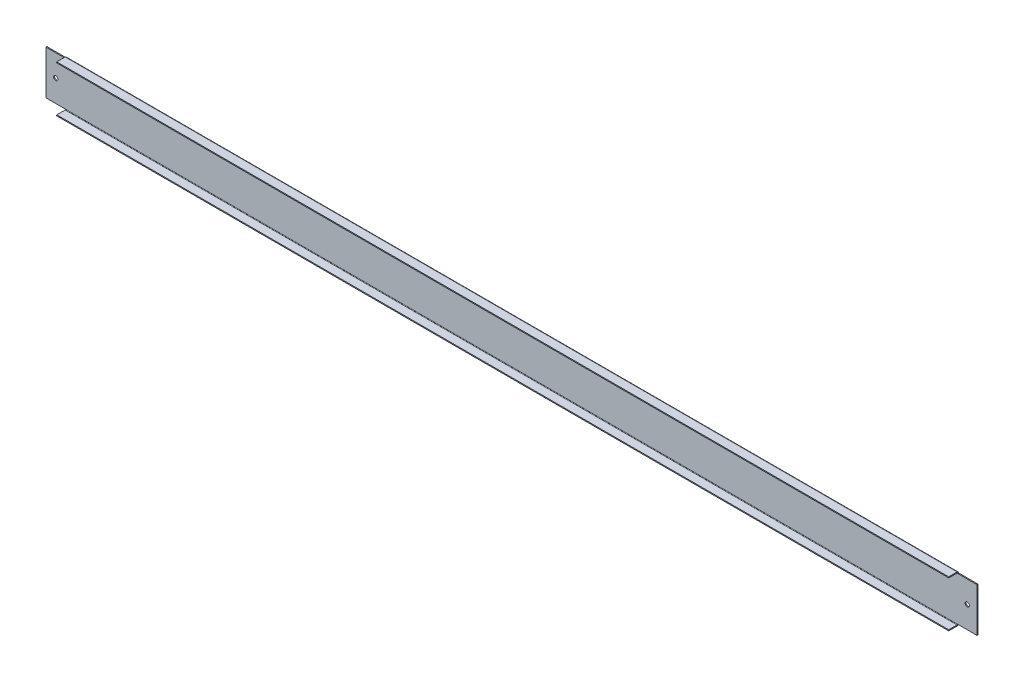
ISO-10303-21;
HEADER;
FILE_DESCRIPTION(('STEP AP214'),'2;1');
FILE_NAME('part.step','',(''),(''),'','','');
FILE_SCHEMA(('AUTOMOTIVE_DESIGN { 1 0 10303 214 1 1 1 1 }'));
ENDSEC;
DATA;
#1=APPLICATION_CONTEXT('core data for automotive mechanical design processes');
#2=APPLICATION_PROTOCOL_DEFINITION('international standard','automotive_design',2000,#1);
#3=PRODUCT_CONTEXT('',#1,'mechanical');
#4=PRODUCT('Part','Part','',(#3));
#5=PRODUCT_RELATED_PRODUCT_CATEGORY('part','',(#4));
#6=PRODUCT_DEFINITION_FORMATION('','',#4);
#7=PRODUCT_DEFINITION_CONTEXT('part definition',#1,'design');
#8=PRODUCT_DEFINITION('design','',#6,#7);
#9=PRODUCT_DEFINITION_SHAPE('','',#8);
#10=(LENGTH_UNIT() NAMED_UNIT(*) SI_UNIT(.MILLI.,.METRE.));
#11=(NAMED_UNIT(*) PLANE_ANGLE_UNIT() SI_UNIT($,.RADIAN.));
#12=(NAMED_UNIT(*) SI_UNIT($,.STERADIAN.) SOLID_ANGLE_UNIT());
#13=UNCERTAINTY_MEASURE_WITH_UNIT(LENGTH_MEASURE(1.E-05),#10,'distance_accuracy_value','');
#14=(GEOMETRIC_REPRESENTATION_CONTEXT(3) GLOBAL_UNCERTAINTY_ASSIGNED_CONTEXT((#13)) GLOBAL_UNIT_ASSIGNED_CONTEXT((#10,
#11,#12)) REPRESENTATION_CONTEXT('',''));
#15=CARTESIAN_POINT('',(0.,0.,0.));
#16=DIRECTION('',(0.,0.,1.));
#17=DIRECTION('',(1.,0.,0.));
#18=AXIS2_PLACEMENT_3D('',#15,#16,#17);
#19=CARTESIAN_POINT('',(-912.816666666667,220.605066666667,0.736600000000007));
#20=DIRECTION('',(-1.,0.,0.));
#21=DIRECTION('',(0.,1.,0.));
#22=AXIS2_PLACEMENT_3D('',#19,#20,#21);
#23=CYLINDRICAL_SURFACE('',#22,2.2366);
#24=DIRECTION('',(-1.,0.,0.));
#25=VECTOR('',#24,1.);
#26=CARTESIAN_POINT('',(0.,222.841666666667,0.736599999999998));
#27=LINE('',#26,#25);
#28=CARTESIAN_POINT('',(487.183333333333,222.841666666667,0.736599999999997));
#29=VERTEX_POINT('',#28);
#30=CARTESIAN_POINT('',(-882.816666666666,222.841666666667,0.736599999999997));
#31=VERTEX_POINT('',#30);
#32=EDGE_CURVE('E213',#29,#31,#27,.T.);
#33=ORIENTED_EDGE('',*,*,#32,.F.);
#34=CARTESIAN_POINT('',(487.183333333333,220.605066666667,0.736600000000007));
#35=DIRECTION('',(-1.,0.,0.));
#36=DIRECTION('',(0.,-1.,0.));
#37=AXIS2_PLACEMENT_3D('',#34,#35,#36);
#38=CIRCLE('',#37,2.2366);
#39=CARTESIAN_POINT('',(487.183333333333,220.605066666667,-1.5));
#40=VERTEX_POINT('',#39);
#41=EDGE_CURVE('E340',#40,#29,#38,.F.);
#42=ORIENTED_EDGE('',*,*,#41,.F.);
#43=DIRECTION('',(-1.,0.,0.));
#44=VECTOR('',#43,1.);
#45=CARTESIAN_POINT('',(-912.816666666667,220.605066666667,-1.5));
#46=LINE('',#45,#44);
#47=CARTESIAN_POINT('',(-882.816666666666,220.605066666667,-1.5));
#48=VERTEX_POINT('',#47);
#49=EDGE_CURVE('E226',#48,#40,#46,.F.);
#50=ORIENTED_EDGE('',*,*,#49,.F.);
#51=CARTESIAN_POINT('',(-882.816666666666,220.605066666667,0.736600000000007));
#52=DIRECTION('',(1.,0.,0.));
#53=DIRECTION('',(0.,1.,0.));
#54=AXIS2_PLACEMENT_3D('',#51,#52,#53);
#55=CIRCLE('',#54,2.2366);
#56=EDGE_CURVE('E297',#31,#48,#55,.F.);
#57=ORIENTED_EDGE('',*,*,#56,.F.);
#58=EDGE_LOOP('',(#33,#42,#50,#57));
#59=FACE_BOUND('',#58,.T.);
#60=ADVANCED_FACE('F76',(#59),#23,.T.);
#61=CARTESIAN_POINT('',(-912.816666666667,220.605066666667,0.736600000000007));
#62=DIRECTION('',(-1.,0.,0.));
#63=DIRECTION('',(0.,1.,0.));
#64=AXIS2_PLACEMENT_3D('',#61,#62,#63);
#65=CYLINDRICAL_SURFACE('',#64,0.736600000000004);
#66=CARTESIAN_POINT('',(487.183333333333,220.605066666667,0.736600000000007));
#67=DIRECTION('',(-1.,0.,0.));
#68=DIRECTION('',(0.,0.,1.));
#69=AXIS2_PLACEMENT_3D('',#66,#67,#68);
#70=CIRCLE('',#69,0.736600000000004);
#71=CARTESIAN_POINT('',(487.183333333333,220.605066666667,2.82409219507679E-13));
#72=VERTEX_POINT('',#71);
#73=CARTESIAN_POINT('',(487.183333333333,221.341666666667,0.736600000000004));
#74=VERTEX_POINT('',#73);
#75=EDGE_CURVE('E344',#72,#74,#70,.F.);
#76=ORIENTED_EDGE('',*,*,#75,.T.);
#77=DIRECTION('',(1.,0.,0.));
#78=VECTOR('',#77,1.);
#79=CARTESIAN_POINT('',(517.183333333333,221.341666666667,0.736600000000004));
#80=LINE('',#79,#78);
#81=CARTESIAN_POINT('',(-882.816666666666,221.341666666667,0.736600000000004));
#82=VERTEX_POINT('',#81);
#83=EDGE_CURVE('E206',#74,#82,#80,.F.);
#84=ORIENTED_EDGE('',*,*,#83,.T.);
#85=CARTESIAN_POINT('',(-882.816666666666,220.605066666667,0.736600000000007));
#86=DIRECTION('',(-1.,0.,0.));
#87=DIRECTION('',(0.,0.,1.));
#88=AXIS2_PLACEMENT_3D('',#85,#86,#87);
#89=CIRCLE('',#88,0.736600000000004);
#90=CARTESIAN_POINT('',(-882.816666666666,220.605066666667,2.86083159905121E-13));
#91=VERTEX_POINT('',#90);
#92=EDGE_CURVE('E302',#82,#91,#89,.T.);
#93=ORIENTED_EDGE('',*,*,#92,.T.);
#94=DIRECTION('',(-1.,0.,0.));
#95=VECTOR('',#94,1.);
#96=CARTESIAN_POINT('',(-912.816666666667,220.605066666667,0.));
#97=LINE('',#96,#95);
#98=EDGE_CURVE('E215',#91,#72,#97,.F.);
#99=ORIENTED_EDGE('',*,*,#98,.T.);
#100=EDGE_LOOP('',(#76,#84,#93,#99));
#101=FACE_BOUND('',#100,.T.);
#102=ADVANCED_FACE('F386',(#101),#65,.F.);
#103=CARTESIAN_POINT('',(0.,222.841666666667,-9.21548144894107E-13));
#104=DIRECTION('',(0.,1.,0.));
#105=DIRECTION('',(0.,0.,1.));
#106=AXIS2_PLACEMENT_3D('',#103,#104,#105);
#107=PLANE('',#106);
#108=DIRECTION('',(-1.,0.,0.));
#109=VECTOR('',#108,1.);
#110=CARTESIAN_POINT('',(-912.816666666667,222.841666666667,13.5));
#111=LINE('',#110,#109);
#112=CARTESIAN_POINT('',(487.183333333333,222.841666666667,13.5000000000003));
#113=VERTEX_POINT('',#112);
#114=CARTESIAN_POINT('',(-882.816666666666,222.841666666667,13.5));
#115=VERTEX_POINT('',#114);
#116=EDGE_CURVE('E212',#113,#115,#111,.T.);
#117=ORIENTED_EDGE('',*,*,#116,.F.);
#118=DIRECTION('',(0.,0.,1.));
#119=VECTOR('',#118,1.);
#120=CARTESIAN_POINT('',(487.183333333333,222.841666666667,-9.22478828578205E-13));
#121=LINE('',#120,#119);
#122=EDGE_CURVE('E199',#29,#113,#121,.T.);
#123=ORIENTED_EDGE('',*,*,#122,.F.);
#124=ORIENTED_EDGE('',*,*,#32,.T.);
#125=DIRECTION('',(0.,0.,1.));
#126=VECTOR('',#125,1.);
#127=CARTESIAN_POINT('',(-882.816666666666,222.841666666667,2.95279918486146E-13));
#128=LINE('',#127,#126);
#129=EDGE_CURVE('E309',#31,#115,#128,.T.);
#130=ORIENTED_EDGE('',*,*,#129,.T.);
#131=EDGE_LOOP('',(#117,#123,#124,#130));
#132=FACE_BOUND('',#131,.T.);
#133=ADVANCED_FACE('F392',(#132),#107,.T.);
#134=CARTESIAN_POINT('',(0.,221.341666666667,-9.16310922885843E-13));
#135=DIRECTION('',(0.,1.,0.));
#136=DIRECTION('',(0.,0.,1.));
#137=AXIS2_PLACEMENT_3D('',#134,#135,#136);
#138=PLANE('',#137);
#139=DIRECTION('',(0.,0.,1.));
#140=VECTOR('',#139,1.);
#141=CARTESIAN_POINT('',(487.183333333333,221.341666666667,-9.16310922885842E-13));
#142=LINE('',#141,#140);
#143=CARTESIAN_POINT('',(487.183333333333,221.341666666667,13.5000000000003));
#144=VERTEX_POINT('',#143);
#145=EDGE_CURVE('E196',#74,#144,#142,.T.);
#146=ORIENTED_EDGE('',*,*,#145,.T.);
#147=DIRECTION('',(1.,0.,0.));
#148=VECTOR('',#147,1.);
#149=CARTESIAN_POINT('',(0.,221.341666666667,13.5));
#150=LINE('',#149,#148);
#151=CARTESIAN_POINT('',(-882.816666666666,221.341666666667,13.5));
#152=VERTEX_POINT('',#151);
#153=EDGE_CURVE('E93',#144,#152,#150,.F.);
#154=ORIENTED_EDGE('',*,*,#153,.T.);
#155=DIRECTION('',(0.,0.,1.));
#156=VECTOR('',#155,1.);
#157=CARTESIAN_POINT('',(-882.816666666666,221.341666666667,-9.15380239201746E-13));
#158=LINE('',#157,#156);
#159=EDGE_CURVE('E307',#82,#152,#158,.T.);
#160=ORIENTED_EDGE('',*,*,#159,.F.);
#161=ORIENTED_EDGE('',*,*,#83,.F.);
#162=EDGE_LOOP('',(#146,#154,#160,#161));
#163=FACE_BOUND('',#162,.T.);
#164=ADVANCED_FACE('F205',(#163),#138,.F.);
#165=CARTESIAN_POINT('',(-912.816666666667,222.841666666667,13.5));
#166=DIRECTION('',(0.,0.,1.));
#167=DIRECTION('',(0.,-1.,0.));
#168=AXIS2_PLACEMENT_3D('',#165,#166,#167);
#169=PLANE('',#168);
#170=ORIENTED_EDGE('',*,*,#153,.F.);
#171=DIRECTION('',(0.,-1.,0.));
#172=VECTOR('',#171,1.);
#173=CARTESIAN_POINT('',(487.183333333333,221.341666666667,13.5000000000003));
#174=LINE('',#173,#172);
#175=EDGE_CURVE('E193',#144,#113,#174,.F.);
#176=ORIENTED_EDGE('',*,*,#175,.T.);
#177=ORIENTED_EDGE('',*,*,#116,.T.);
#178=DIRECTION('',(0.,1.,0.));
#179=VECTOR('',#178,1.);
#180=CARTESIAN_POINT('',(-882.816666666666,222.841666666667,13.5));
#181=LINE('',#180,#179);
#182=EDGE_CURVE('E211',#115,#152,#181,.F.);
#183=ORIENTED_EDGE('',*,*,#182,.T.);
#184=EDGE_LOOP('',(#170,#176,#177,#183));
#185=FACE_BOUND('',#184,.T.);
#186=ADVANCED_FACE('F209',(#185),#169,.T.);
#187=CARTESIAN_POINT('',(517.183333333333,153.078266666667,0.736600000000115));
#188=DIRECTION('',(1.,0.,0.));
#189=DIRECTION('',(0.,-1.,0.));
#190=AXIS2_PLACEMENT_3D('',#187,#188,#189);
#191=CYLINDRICAL_SURFACE('',#190,2.23660000000009);
#192=DIRECTION('',(1.,0.,0.));
#193=VECTOR('',#192,1.);
#194=CARTESIAN_POINT('',(517.183333333333,153.078266666667,-1.49999999999997));
#195=LINE('',#194,#193);
#196=CARTESIAN_POINT('',(487.183333333333,153.078266666667,-1.49999999999997));
#197=VERTEX_POINT('',#196);
#198=CARTESIAN_POINT('',(-882.816666666666,153.078266666667,-1.50000000000008));
#199=VERTEX_POINT('',#198);
#200=EDGE_CURVE('E263',#197,#199,#195,.F.);
#201=ORIENTED_EDGE('',*,*,#200,.F.);
#202=CARTESIAN_POINT('',(487.183333333333,153.078266666667,0.736600000000113));
#203=DIRECTION('',(-1.,0.,0.));
#204=DIRECTION('',(0.,-1.,0.));
#205=AXIS2_PLACEMENT_3D('',#202,#203,#204);
#206=CIRCLE('',#205,2.23660000000009);
#207=CARTESIAN_POINT('',(487.183333333333,150.841666666667,0.7366));
#208=VERTEX_POINT('',#207);
#209=EDGE_CURVE('E327',#208,#197,#206,.F.);
#210=ORIENTED_EDGE('',*,*,#209,.F.);
#211=DIRECTION('',(1.,0.,0.));
#212=VECTOR('',#211,1.);
#213=CARTESIAN_POINT('',(0.,150.841666666667,0.736600000000069));
#214=LINE('',#213,#212);
#215=CARTESIAN_POINT('',(-882.816666666666,150.841666666667,0.736599999999997));
#216=VERTEX_POINT('',#215);
#217=EDGE_CURVE('E270',#216,#208,#214,.T.);
#218=ORIENTED_EDGE('',*,*,#217,.F.);
#219=CARTESIAN_POINT('',(-882.816666666666,153.078266666667,0.736600000000012));
#220=DIRECTION('',(1.,0.,0.));
#221=DIRECTION('',(0.,1.,0.));
#222=AXIS2_PLACEMENT_3D('',#219,#220,#221);
#223=CIRCLE('',#222,2.23660000000009);
#224=EDGE_CURVE('E288',#199,#216,#223,.F.);
#225=ORIENTED_EDGE('',*,*,#224,.F.);
#226=EDGE_LOOP('',(#201,#210,#218,#225));
#227=FACE_BOUND('',#226,.T.);
#228=ADVANCED_FACE('F464',(#227),#191,.T.);
#229=CARTESIAN_POINT('',(517.183333333333,153.078266666667,0.736600000000115));
#230=DIRECTION('',(1.,0.,0.));
#231=DIRECTION('',(0.,-1.,0.));
#232=AXIS2_PLACEMENT_3D('',#229,#230,#231);
#233=CYLINDRICAL_SURFACE('',#232,0.736600000000087);
#234=CARTESIAN_POINT('',(487.183333333333,153.078266666667,0.736600000000113));
#235=DIRECTION('',(1.,0.,0.));
#236=DIRECTION('',(0.,0.,-1.));
#237=AXIS2_PLACEMENT_3D('',#234,#235,#236);
#238=CIRCLE('',#237,0.736600000000087);
#239=CARTESIAN_POINT('',(487.183333333333,152.341666666667,0.736600000000111));
#240=VERTEX_POINT('',#239);
#241=CARTESIAN_POINT('',(487.183333333333,153.078266666667,0.));
#242=VERTEX_POINT('',#241);
#243=EDGE_CURVE('E324',#240,#242,#238,.T.);
#244=ORIENTED_EDGE('',*,*,#243,.T.);
#245=DIRECTION('',(1.,0.,0.));
#246=VECTOR('',#245,1.);
#247=CARTESIAN_POINT('',(517.183333333333,153.078266666667,0.));
#248=LINE('',#247,#246);
#249=CARTESIAN_POINT('',(-882.816666666666,153.078266666667,0.));
#250=VERTEX_POINT('',#249);
#251=EDGE_CURVE('E264',#242,#250,#248,.F.);
#252=ORIENTED_EDGE('',*,*,#251,.T.);
#253=CARTESIAN_POINT('',(-882.816666666666,153.078266666667,0.736600000000012));
#254=DIRECTION('',(1.,0.,0.));
#255=DIRECTION('',(0.,0.,-1.));
#256=AXIS2_PLACEMENT_3D('',#253,#254,#255);
#257=CIRCLE('',#256,0.736600000000087);
#258=CARTESIAN_POINT('',(-882.816666666666,152.341666666667,0.736600000000008));
#259=VERTEX_POINT('',#258);
#260=EDGE_CURVE('E286',#250,#259,#257,.F.);
#261=ORIENTED_EDGE('',*,*,#260,.T.);
#262=DIRECTION('',(-1.,0.,0.));
#263=VECTOR('',#262,1.);
#264=CARTESIAN_POINT('',(-912.816666666666,152.341666666667,0.736600000000004));
#265=LINE('',#264,#263);
#266=EDGE_CURVE('E267',#259,#240,#265,.F.);
#267=ORIENTED_EDGE('',*,*,#266,.T.);
#268=EDGE_LOOP('',(#244,#252,#261,#267));
#269=FACE_BOUND('',#268,.T.);
#270=ADVANCED_FACE('F456',(#269),#233,.F.);
#271=CARTESIAN_POINT('',(0.,150.841666666667,6.15014227644204E-13));
#272=DIRECTION('',(0.,-1.,0.));
#273=DIRECTION('',(0.,0.,-1.));
#274=AXIS2_PLACEMENT_3D('',#271,#272,#273);
#275=PLANE('',#274);
#276=ORIENTED_EDGE('',*,*,#217,.T.);
#277=DIRECTION('',(0.,0.,-1.));
#278=VECTOR('',#277,1.);
#279=CARTESIAN_POINT('',(487.183333333333,150.841666666667,0.));
#280=LINE('',#279,#278);
#281=CARTESIAN_POINT('',(487.183333333333,150.841666666667,13.5));
#282=VERTEX_POINT('',#281);
#283=EDGE_CURVE('E322',#282,#208,#280,.T.);
#284=ORIENTED_EDGE('',*,*,#283,.F.);
#285=DIRECTION('',(1.,0.,0.));
#286=VECTOR('',#285,1.);
#287=CARTESIAN_POINT('',(517.183333333333,150.841666666667,13.5));
#288=LINE('',#287,#286);
#289=CARTESIAN_POINT('',(-882.816666666666,150.841666666667,13.5));
#290=VERTEX_POINT('',#289);
#291=EDGE_CURVE('E277',#290,#282,#288,.T.);
#292=ORIENTED_EDGE('',*,*,#291,.F.);
#293=DIRECTION('',(0.,0.,-1.));
#294=VECTOR('',#293,1.);
#295=CARTESIAN_POINT('',(-882.816666666666,150.841666666667,6.14083543960106E-13));
#296=LINE('',#295,#294);
#297=EDGE_CURVE('E101',#216,#290,#296,.F.);
#298=ORIENTED_EDGE('',*,*,#297,.F.);
#299=EDGE_LOOP('',(#276,#284,#292,#298));
#300=FACE_BOUND('',#299,.T.);
#301=ADVANCED_FACE('F452',(#300),#275,.T.);
#302=CARTESIAN_POINT('',(0.,152.341666666667,6.20251449652468E-13));
#303=DIRECTION('',(0.,-1.,0.));
#304=DIRECTION('',(0.,0.,-1.));
#305=AXIS2_PLACEMENT_3D('',#302,#303,#304);
#306=PLANE('',#305);
#307=DIRECTION('',(0.,0.,-1.));
#308=VECTOR('',#307,1.);
#309=CARTESIAN_POINT('',(487.183333333333,152.341666666667,6.21182133336566E-13));
#310=LINE('',#309,#308);
#311=CARTESIAN_POINT('',(487.183333333333,152.341666666667,13.5));
#312=VERTEX_POINT('',#311);
#313=EDGE_CURVE('E319',#312,#240,#310,.T.);
#314=ORIENTED_EDGE('',*,*,#313,.T.);
#315=ORIENTED_EDGE('',*,*,#266,.F.);
#316=DIRECTION('',(0.,0.,1.));
#317=VECTOR('',#316,1.);
#318=CARTESIAN_POINT('',(-882.816666666666,152.341666666667,6.20251449652468E-13));
#319=LINE('',#318,#317);
#320=CARTESIAN_POINT('',(-882.816666666666,152.341666666667,13.5));
#321=VERTEX_POINT('',#320);
#322=EDGE_CURVE('E283',#259,#321,#319,.T.);
#323=ORIENTED_EDGE('',*,*,#322,.T.);
#324=DIRECTION('',(-1.,0.,0.));
#325=VECTOR('',#324,1.);
#326=CARTESIAN_POINT('',(0.,152.341666666667,13.5));
#327=LINE('',#326,#325);
#328=EDGE_CURVE('E274',#321,#312,#327,.F.);
#329=ORIENTED_EDGE('',*,*,#328,.T.);
#330=EDGE_LOOP('',(#314,#315,#323,#329));
#331=FACE_BOUND('',#330,.T.);
#332=ADVANCED_FACE('F455',(#331),#306,.F.);
#333=CARTESIAN_POINT('',(517.183333333333,150.841666666667,13.5));
#334=DIRECTION('',(0.,0.,1.));
#335=DIRECTION('',(0.,-1.,0.));
#336=AXIS2_PLACEMENT_3D('',#333,#334,#335);
#337=PLANE('',#336);
#338=ORIENTED_EDGE('',*,*,#291,.T.);
#339=DIRECTION('',(0.,-1.,0.));
#340=VECTOR('',#339,1.);
#341=CARTESIAN_POINT('',(487.183333333333,150.841666666667,13.5));
#342=LINE('',#341,#340);
#343=EDGE_CURVE('E316',#282,#312,#342,.F.);
#344=ORIENTED_EDGE('',*,*,#343,.T.);
#345=ORIENTED_EDGE('',*,*,#328,.F.);
#346=DIRECTION('',(0.,1.,0.));
#347=VECTOR('',#346,1.);
#348=CARTESIAN_POINT('',(-882.816666666666,152.341666666667,13.5));
#349=LINE('',#348,#347);
#350=EDGE_CURVE('E271',#321,#290,#349,.F.);
#351=ORIENTED_EDGE('',*,*,#350,.T.);
#352=EDGE_LOOP('',(#338,#344,#345,#351));
#353=FACE_BOUND('',#352,.T.);
#354=ADVANCED_FACE('F400',(#353),#337,.T.);
#355=CARTESIAN_POINT('',(0.,0.,-1.5));
#356=DIRECTION('',(0.,0.,-1.));
#357=DIRECTION('',(-1.,0.,0.));
#358=AXIS2_PLACEMENT_3D('',#355,#356,#357);
#359=PLANE('',#358);
#360=CARTESIAN_POINT('',(-897.816666666666,186.841666666667,-1.5));
#361=DIRECTION('',(0.,0.,-1.));
#362=DIRECTION('',(-1.,0.,0.));
#363=AXIS2_PLACEMENT_3D('',#360,#361,#362);
#364=CIRCLE('',#363,3.24999999999995);
#365=CARTESIAN_POINT('',(-901.066666666666,186.841666666667,-1.5));
#366=VERTEX_POINT('',#365);
#367=EDGE_CURVE('E355',#366,#366,#364,.T.);
#368=ORIENTED_EDGE('',*,*,#367,.F.);
#369=EDGE_LOOP('',(#368));
#370=FACE_BOUND('',#369,.T.);
#371=CARTESIAN_POINT('',(502.183333333333,186.841666666667,-1.5));
#372=DIRECTION('',(0.,0.,-1.));
#373=DIRECTION('',(-1.,0.,0.));
#374=AXIS2_PLACEMENT_3D('',#371,#372,#373);
#375=CIRCLE('',#374,3.24999999999995);
#376=CARTESIAN_POINT('',(498.933333333333,186.841666666667,-1.5));
#377=VERTEX_POINT('',#376);
#378=EDGE_CURVE('E202',#377,#377,#375,.T.);
#379=ORIENTED_EDGE('',*,*,#378,.F.);
#380=EDGE_LOOP('',(#379));
#381=FACE_BOUND('',#380,.T.);
#382=DIRECTION('',(0.,1.,0.));
#383=VECTOR('',#382,1.);
#384=CARTESIAN_POINT('',(517.183333333333,222.841666666667,-1.5));
#385=LINE('',#384,#383);
#386=CARTESIAN_POINT('',(517.183333333333,153.078266666667,-1.49999999999997));
#387=VERTEX_POINT('',#386);
#388=CARTESIAN_POINT('',(517.183333333333,220.605066666667,-1.5));
#389=VERTEX_POINT('',#388);
#390=EDGE_CURVE('E85',#387,#389,#385,.T.);
#391=ORIENTED_EDGE('',*,*,#390,.F.);
#392=EDGE_CURVE('E259',#387,#197,#195,.F.);
#393=ORIENTED_EDGE('',*,*,#392,.T.);
#394=ORIENTED_EDGE('',*,*,#200,.T.);
#395=DIRECTION('',(1.,0.,0.));
#396=VECTOR('',#395,1.);
#397=CARTESIAN_POINT('',(517.183333333333,153.078266666667,-1.49999999999997));
#398=LINE('',#397,#396);
#399=CARTESIAN_POINT('',(-912.816666666666,153.078266666667,-1.50000000000008));
#400=VERTEX_POINT('',#399);
#401=EDGE_CURVE('E295',#199,#400,#398,.F.);
#402=ORIENTED_EDGE('',*,*,#401,.T.);
#403=DIRECTION('',(0.,-1.,0.));
#404=VECTOR('',#403,1.);
#405=CARTESIAN_POINT('',(-912.816666666667,222.841666666667,-1.5));
#406=LINE('',#405,#404);
#407=CARTESIAN_POINT('',(-912.816666666667,220.605066666667,-1.5));
#408=VERTEX_POINT('',#407);
#409=EDGE_CURVE('E13',#408,#400,#406,.T.);
#410=ORIENTED_EDGE('',*,*,#409,.F.);
#411=EDGE_CURVE('E222',#408,#48,#46,.F.);
#412=ORIENTED_EDGE('',*,*,#411,.T.);
#413=ORIENTED_EDGE('',*,*,#49,.T.);
#414=DIRECTION('',(-1.,0.,0.));
#415=VECTOR('',#414,1.);
#416=CARTESIAN_POINT('',(-912.816666666667,220.605066666667,-1.5));
#417=LINE('',#416,#415);
#418=EDGE_CURVE('E334',#40,#389,#417,.F.);
#419=ORIENTED_EDGE('',*,*,#418,.T.);
#420=EDGE_LOOP('',(#391,#393,#394,#402,#410,#412,#413,#419));
#421=FACE_BOUND('',#420,.T.);
#422=ADVANCED_FACE('F366',(#370,#381,#421),#359,.T.);
#423=CARTESIAN_POINT('',(0.,0.,0.));
#424=DIRECTION('',(0.,0.,-1.));
#425=DIRECTION('',(-1.,0.,0.));
#426=AXIS2_PLACEMENT_3D('',#423,#424,#425);
#427=PLANE('',#426);
#428=CARTESIAN_POINT('',(-897.816666666666,186.841666666667,0.));
#429=DIRECTION('',(0.,0.,1.));
#430=DIRECTION('',(1.,0.,0.));
#431=AXIS2_PLACEMENT_3D('',#428,#429,#430);
#432=CIRCLE('',#431,3.24999999999995);
#433=CARTESIAN_POINT('',(-894.566666666666,186.841666666667,0.));
#434=VERTEX_POINT('',#433);
#435=EDGE_CURVE('E358',#434,#434,#432,.T.);
#436=ORIENTED_EDGE('',*,*,#435,.F.);
#437=EDGE_LOOP('',(#436));
#438=FACE_BOUND('',#437,.T.);
#439=CARTESIAN_POINT('',(502.183333333333,186.841666666667,0.));
#440=DIRECTION('',(0.,0.,1.));
#441=DIRECTION('',(1.,0.,0.));
#442=AXIS2_PLACEMENT_3D('',#439,#440,#441);
#443=CIRCLE('',#442,3.24999999999995);
#444=CARTESIAN_POINT('',(505.433333333333,186.841666666667,0.));
#445=VERTEX_POINT('',#444);
#446=EDGE_CURVE('E352',#445,#445,#443,.T.);
#447=ORIENTED_EDGE('',*,*,#446,.F.);
#448=EDGE_LOOP('',(#447));
#449=FACE_BOUND('',#448,.T.);
#450=CARTESIAN_POINT('',(517.183333333333,153.078266666667,0.));
#451=VERTEX_POINT('',#450);
#452=EDGE_CURVE('E261',#451,#242,#248,.F.);
#453=ORIENTED_EDGE('',*,*,#452,.F.);
#454=DIRECTION('',(0.,1.,0.));
#455=VECTOR('',#454,1.);
#456=CARTESIAN_POINT('',(517.183333333333,222.841666666667,0.));
#457=LINE('',#456,#455);
#458=CARTESIAN_POINT('',(517.183333333333,220.605066666667,0.));
#459=VERTEX_POINT('',#458);
#460=EDGE_CURVE('E231',#451,#459,#457,.T.);
#461=ORIENTED_EDGE('',*,*,#460,.T.);
#462=DIRECTION('',(-1.,0.,0.));
#463=VECTOR('',#462,1.);
#464=CARTESIAN_POINT('',(-912.816666666667,220.605066666667,0.));
#465=LINE('',#464,#463);
#466=EDGE_CURVE('E338',#72,#459,#465,.F.);
#467=ORIENTED_EDGE('',*,*,#466,.F.);
#468=ORIENTED_EDGE('',*,*,#98,.F.);
#469=CARTESIAN_POINT('',(-912.816666666666,220.605066666667,2.86012533101676E-13));
#470=VERTEX_POINT('',#469);
#471=EDGE_CURVE('E227',#470,#91,#97,.F.);
#472=ORIENTED_EDGE('',*,*,#471,.F.);
#473=DIRECTION('',(0.,-1.,0.));
#474=VECTOR('',#473,1.);
#475=CARTESIAN_POINT('',(-912.816666666667,222.841666666667,0.));
#476=LINE('',#475,#474);
#477=CARTESIAN_POINT('',(-912.816666666666,153.078266666667,0.));
#478=VERTEX_POINT('',#477);
#479=EDGE_CURVE('E80',#470,#478,#476,.T.);
#480=ORIENTED_EDGE('',*,*,#479,.T.);
#481=DIRECTION('',(1.,0.,0.));
#482=VECTOR('',#481,1.);
#483=CARTESIAN_POINT('',(517.183333333333,153.078266666667,0.));
#484=LINE('',#483,#482);
#485=EDGE_CURVE('E247',#250,#478,#484,.F.);
#486=ORIENTED_EDGE('',*,*,#485,.F.);
#487=ORIENTED_EDGE('',*,*,#251,.F.);
#488=EDGE_LOOP('',(#453,#461,#467,#468,#472,#480,#486,#487));
#489=FACE_BOUND('',#488,.T.);
#490=ADVANCED_FACE('F245',(#438,#449,#489),#427,.F.);
#491=CARTESIAN_POINT('',(517.183333333333,222.841666666667,-1.5));
#492=DIRECTION('',(1.,0.,0.));
#493=DIRECTION('',(0.,0.,-1.));
#494=AXIS2_PLACEMENT_3D('',#491,#492,#493);
#495=PLANE('',#494);
#496=ORIENTED_EDGE('',*,*,#460,.F.);
#497=DIRECTION('',(0.,1.13041985944715E-13,-1.));
#498=VECTOR('',#497,1.);
#499=CARTESIAN_POINT('',(517.183333333333,153.078266666667,0.));
#500=LINE('',#499,#498);
#501=EDGE_CURVE('E256',#451,#387,#500,.T.);
#502=ORIENTED_EDGE('',*,*,#501,.T.);
#503=ORIENTED_EDGE('',*,*,#390,.T.);
#504=DIRECTION('',(0.,0.,-1.));
#505=VECTOR('',#504,1.);
#506=CARTESIAN_POINT('',(517.183333333333,220.605066666667,0.));
#507=LINE('',#506,#505);
#508=EDGE_CURVE('E229',#459,#389,#507,.T.);
#509=ORIENTED_EDGE('',*,*,#508,.F.);
#510=EDGE_LOOP('',(#496,#502,#503,#509));
#511=FACE_BOUND('',#510,.T.);
#512=ADVANCED_FACE('F78',(#511),#495,.T.);
#513=CARTESIAN_POINT('',(-912.816666666667,222.841666666667,-1.5));
#514=DIRECTION('',(-1.,0.,0.));
#515=DIRECTION('',(0.,-1.,0.));
#516=AXIS2_PLACEMENT_3D('',#513,#514,#515);
#517=PLANE('',#516);
#518=DIRECTION('',(0.,1.13041985944715E-13,-1.));
#519=VECTOR('',#518,1.);
#520=CARTESIAN_POINT('',(-912.816666666666,153.078266666667,0.));
#521=LINE('',#520,#519);
#522=EDGE_CURVE('E221',#478,#400,#521,.T.);
#523=ORIENTED_EDGE('',*,*,#522,.F.);
#524=ORIENTED_EDGE('',*,*,#479,.F.);
#525=DIRECTION('',(0.,0.,-1.));
#526=VECTOR('',#525,1.);
#527=CARTESIAN_POINT('',(-912.816666666667,220.605066666667,0.));
#528=LINE('',#527,#526);
#529=EDGE_CURVE('E225',#470,#408,#528,.T.);
#530=ORIENTED_EDGE('',*,*,#529,.T.);
#531=ORIENTED_EDGE('',*,*,#409,.T.);
#532=EDGE_LOOP('',(#523,#524,#530,#531));
#533=FACE_BOUND('',#532,.T.);
#534=ADVANCED_FACE('F251',(#533),#517,.T.);
#535=CARTESIAN_POINT('',(-882.816666666666,152.341666666667,6.20251449652468E-13));
#536=DIRECTION('',(1.,0.,0.));
#537=DIRECTION('',(0.,0.,1.));
#538=AXIS2_PLACEMENT_3D('',#535,#536,#537);
#539=PLANE('',#538);
#540=ORIENTED_EDGE('',*,*,#350,.F.);
#541=ORIENTED_EDGE('',*,*,#322,.F.);
#542=DIRECTION('',(0.,1.,0.));
#543=VECTOR('',#542,1.);
#544=CARTESIAN_POINT('',(-882.816666666666,152.341666666667,0.736600000000004));
#545=LINE('',#544,#543);
#546=EDGE_CURVE('E280',#259,#216,#545,.F.);
#547=ORIENTED_EDGE('',*,*,#546,.T.);
#548=ORIENTED_EDGE('',*,*,#297,.T.);
#549=EDGE_LOOP('',(#540,#541,#547,#548));
#550=FACE_BOUND('',#549,.T.);
#551=ADVANCED_FACE('F403',(#550),#539,.F.);
#552=CARTESIAN_POINT('',(-882.816666666666,153.078266666667,0.736600000000012));
#553=DIRECTION('',(-1.,0.,0.));
#554=DIRECTION('',(0.,-1.,0.));
#555=AXIS2_PLACEMENT_3D('',#552,#553,#554);
#556=PLANE('',#555);
#557=ORIENTED_EDGE('',*,*,#224,.T.);
#558=ORIENTED_EDGE('',*,*,#546,.F.);
#559=ORIENTED_EDGE('',*,*,#260,.F.);
#560=DIRECTION('',(0.,0.,1.));
#561=VECTOR('',#560,1.);
#562=CARTESIAN_POINT('',(-882.816666666666,153.078266666667,0.));
#563=LINE('',#562,#561);
#564=EDGE_CURVE('E290',#250,#199,#563,.F.);
#565=ORIENTED_EDGE('',*,*,#564,.T.);
#566=EDGE_LOOP('',(#557,#558,#559,#565));
#567=FACE_BOUND('',#566,.T.);
#568=ADVANCED_FACE('F408',(#567),#556,.T.);
#569=CARTESIAN_POINT('',(-897.816666666666,153.078266666667,0.));
#570=DIRECTION('',(0.,1.,1.13041985944715E-13));
#571=DIRECTION('',(1.,0.,0.));
#572=AXIS2_PLACEMENT_3D('',#569,#570,#571);
#573=PLANE('',#572);
#574=ORIENTED_EDGE('',*,*,#485,.T.);
#575=ORIENTED_EDGE('',*,*,#522,.T.);
#576=ORIENTED_EDGE('',*,*,#401,.F.);
#577=ORIENTED_EDGE('',*,*,#564,.F.);
#578=EDGE_LOOP('',(#574,#575,#576,#577));
#579=FACE_BOUND('',#578,.T.);
#580=ADVANCED_FACE('F446',(#579),#573,.F.);
#581=CARTESIAN_POINT('',(-882.816666666666,222.841666666667,2.95279918486146E-13));
#582=DIRECTION('',(-1.,0.,0.));
#583=DIRECTION('',(0.,0.,1.));
#584=AXIS2_PLACEMENT_3D('',#581,#582,#583);
#585=PLANE('',#584);
#586=ORIENTED_EDGE('',*,*,#129,.F.);
#587=DIRECTION('',(0.,1.,0.));
#588=VECTOR('',#587,1.);
#589=CARTESIAN_POINT('',(-882.816666666666,222.841666666667,0.736599999999997));
#590=LINE('',#589,#588);
#591=EDGE_CURVE('E305',#31,#82,#590,.F.);
#592=ORIENTED_EDGE('',*,*,#591,.T.);
#593=ORIENTED_EDGE('',*,*,#159,.T.);
#594=ORIENTED_EDGE('',*,*,#182,.F.);
#595=EDGE_LOOP('',(#586,#592,#593,#594));
#596=FACE_BOUND('',#595,.T.);
#597=ADVANCED_FACE('F424',(#596),#585,.T.);
#598=CARTESIAN_POINT('',(-882.816666666666,220.605066666667,0.736600000000007));
#599=DIRECTION('',(-1.,0.,0.));
#600=DIRECTION('',(0.,-1.,0.));
#601=AXIS2_PLACEMENT_3D('',#598,#599,#600);
#602=PLANE('',#601);
#603=ORIENTED_EDGE('',*,*,#591,.F.);
#604=ORIENTED_EDGE('',*,*,#56,.T.);
#605=DIRECTION('',(0.,0.,1.));
#606=VECTOR('',#605,1.);
#607=CARTESIAN_POINT('',(-882.816666666666,220.605066666667,2.86083159905121E-13));
#608=LINE('',#607,#606);
#609=EDGE_CURVE('E299',#91,#48,#608,.F.);
#610=ORIENTED_EDGE('',*,*,#609,.F.);
#611=ORIENTED_EDGE('',*,*,#92,.F.);
#612=EDGE_LOOP('',(#603,#604,#610,#611));
#613=FACE_BOUND('',#612,.T.);
#614=ADVANCED_FACE('F428',(#613),#602,.T.);
#615=CARTESIAN_POINT('',(-897.816666666666,220.605066666667,0.));
#616=DIRECTION('',(0.,-1.,0.));
#617=DIRECTION('',(-1.,0.,0.));
#618=AXIS2_PLACEMENT_3D('',#615,#616,#617);
#619=PLANE('',#618);
#620=ORIENTED_EDGE('',*,*,#529,.F.);
#621=ORIENTED_EDGE('',*,*,#471,.T.);
#622=ORIENTED_EDGE('',*,*,#609,.T.);
#623=ORIENTED_EDGE('',*,*,#411,.F.);
#624=EDGE_LOOP('',(#620,#621,#622,#623));
#625=FACE_BOUND('',#624,.T.);
#626=ADVANCED_FACE('F432',(#625),#619,.F.);
#627=CARTESIAN_POINT('',(487.183333333333,150.841666666667,0.));
#628=DIRECTION('',(-1.,0.,0.));
#629=DIRECTION('',(0.,0.,-1.));
#630=AXIS2_PLACEMENT_3D('',#627,#628,#629);
#631=PLANE('',#630);
#632=ORIENTED_EDGE('',*,*,#283,.T.);
#633=DIRECTION('',(0.,-1.,0.));
#634=VECTOR('',#633,1.);
#635=CARTESIAN_POINT('',(487.183333333333,150.841666666667,0.7366));
#636=LINE('',#635,#634);
#637=EDGE_CURVE('E312',#208,#240,#636,.F.);
#638=ORIENTED_EDGE('',*,*,#637,.T.);
#639=ORIENTED_EDGE('',*,*,#313,.F.);
#640=ORIENTED_EDGE('',*,*,#343,.F.);
#641=EDGE_LOOP('',(#632,#638,#639,#640));
#642=FACE_BOUND('',#641,.T.);
#643=ADVANCED_FACE('F434',(#642),#631,.F.);
#644=CARTESIAN_POINT('',(487.183333333333,153.078266666667,0.736600000000113));
#645=DIRECTION('',(1.,0.,0.));
#646=DIRECTION('',(0.,1.,0.));
#647=AXIS2_PLACEMENT_3D('',#644,#645,#646);
#648=PLANE('',#647);
#649=ORIENTED_EDGE('',*,*,#637,.F.);
#650=ORIENTED_EDGE('',*,*,#209,.T.);
#651=DIRECTION('',(0.,-1.13041985944712E-13,1.));
#652=VECTOR('',#651,1.);
#653=CARTESIAN_POINT('',(487.183333333333,153.078266666667,0.));
#654=LINE('',#653,#652);
#655=EDGE_CURVE('E329',#242,#197,#654,.F.);
#656=ORIENTED_EDGE('',*,*,#655,.F.);
#657=ORIENTED_EDGE('',*,*,#243,.F.);
#658=EDGE_LOOP('',(#649,#650,#656,#657));
#659=FACE_BOUND('',#658,.T.);
#660=ADVANCED_FACE('F440',(#659),#648,.T.);
#661=CARTESIAN_POINT('',(502.183333333333,153.078266666667,0.));
#662=DIRECTION('',(0.,1.,1.13041985944715E-13));
#663=DIRECTION('',(1.,0.,0.));
#664=AXIS2_PLACEMENT_3D('',#661,#662,#663);
#665=PLANE('',#664);
#666=ORIENTED_EDGE('',*,*,#501,.F.);
#667=ORIENTED_EDGE('',*,*,#452,.T.);
#668=ORIENTED_EDGE('',*,*,#655,.T.);
#669=ORIENTED_EDGE('',*,*,#392,.F.);
#670=EDGE_LOOP('',(#666,#667,#668,#669));
#671=FACE_BOUND('',#670,.T.);
#672=ADVANCED_FACE('F545',(#671),#665,.F.);
#673=CARTESIAN_POINT('',(487.183333333333,221.341666666667,-9.16310922885842E-13));
#674=DIRECTION('',(-1.,0.,0.));
#675=DIRECTION('',(0.,0.,1.));
#676=AXIS2_PLACEMENT_3D('',#673,#674,#675);
#677=PLANE('',#676);
#678=ORIENTED_EDGE('',*,*,#175,.F.);
#679=ORIENTED_EDGE('',*,*,#145,.F.);
#680=DIRECTION('',(0.,-1.,0.));
#681=VECTOR('',#680,1.);
#682=CARTESIAN_POINT('',(487.183333333333,221.341666666667,0.736600000000004));
#683=LINE('',#682,#681);
#684=EDGE_CURVE('E341',#74,#29,#683,.F.);
#685=ORIENTED_EDGE('',*,*,#684,.T.);
#686=ORIENTED_EDGE('',*,*,#122,.T.);
#687=EDGE_LOOP('',(#678,#679,#685,#686));
#688=FACE_BOUND('',#687,.T.);
#689=ADVANCED_FACE('F194',(#688),#677,.F.);
#690=CARTESIAN_POINT('',(487.183333333333,220.605066666667,0.736600000000007));
#691=DIRECTION('',(1.,0.,0.));
#692=DIRECTION('',(0.,1.,0.));
#693=AXIS2_PLACEMENT_3D('',#690,#691,#692);
#694=PLANE('',#693);
#695=ORIENTED_EDGE('',*,*,#41,.T.);
#696=ORIENTED_EDGE('',*,*,#684,.F.);
#697=ORIENTED_EDGE('',*,*,#75,.F.);
#698=DIRECTION('',(0.,0.,1.));
#699=VECTOR('',#698,1.);
#700=CARTESIAN_POINT('',(487.183333333333,220.605066666667,2.82409219507679E-13));
#701=LINE('',#700,#699);
#702=EDGE_CURVE('E337',#72,#40,#701,.F.);
#703=ORIENTED_EDGE('',*,*,#702,.T.);
#704=EDGE_LOOP('',(#695,#696,#697,#703));
#705=FACE_BOUND('',#704,.T.);
#706=ADVANCED_FACE('F381',(#705),#694,.T.);
#707=CARTESIAN_POINT('',(502.183333333333,220.605066666667,0.));
#708=DIRECTION('',(0.,-1.,0.));
#709=DIRECTION('',(-1.,0.,0.));
#710=AXIS2_PLACEMENT_3D('',#707,#708,#709);
#711=PLANE('',#710);
#712=ORIENTED_EDGE('',*,*,#466,.T.);
#713=ORIENTED_EDGE('',*,*,#508,.T.);
#714=ORIENTED_EDGE('',*,*,#418,.F.);
#715=ORIENTED_EDGE('',*,*,#702,.F.);
#716=EDGE_LOOP('',(#712,#713,#714,#715));
#717=FACE_BOUND('',#716,.T.);
#718=ADVANCED_FACE('F372',(#717),#711,.F.);
#719=CARTESIAN_POINT('',(502.183333333333,186.841666666667,-10.));
#720=DIRECTION('',(0.,0.,1.));
#721=DIRECTION('',(1.,0.,0.));
#722=AXIS2_PLACEMENT_3D('',#719,#720,#721);
#723=CYLINDRICAL_SURFACE('',#722,3.24999999999995);
#724=ORIENTED_EDGE('',*,*,#378,.T.);
#725=EDGE_LOOP('',(#724));
#726=FACE_BOUND('',#725,.T.);
#727=ORIENTED_EDGE('',*,*,#446,.T.);
#728=EDGE_LOOP('',(#727));
#729=FACE_BOUND('',#728,.T.);
#730=ADVANCED_FACE('F370',(#726,#729),#723,.F.);
#731=CARTESIAN_POINT('',(-897.816666666666,186.841666666667,-10.));
#732=DIRECTION('',(0.,0.,1.));
#733=DIRECTION('',(1.,0.,0.));
#734=AXIS2_PLACEMENT_3D('',#731,#732,#733);
#735=CYLINDRICAL_SURFACE('',#734,3.24999999999995);
#736=ORIENTED_EDGE('',*,*,#367,.T.);
#737=EDGE_LOOP('',(#736));
#738=FACE_BOUND('',#737,.T.);
#739=ORIENTED_EDGE('',*,*,#435,.T.);
#740=EDGE_LOOP('',(#739));
#741=FACE_BOUND('',#740,.T.);
#742=ADVANCED_FACE('F362',(#738,#741),#735,.F.);
#743=CLOSED_SHELL('',(#60,#102,#133,#164,#186,#228,#270,#301,#332,#354,#422,#490,#512,#534,#551,
#568,#580,#597,#614,#626,#643,#660,#672,#689,#706,#718,#730,#742));
#744=MANIFOLD_SOLID_BREP('B2',#743);
#745=ADVANCED_BREP_SHAPE_REPRESENTATION('',(#18,#744),#14);
#746=SHAPE_DEFINITION_REPRESENTATION(#9,#745);
ENDSEC;
END-ISO-10303-21;
